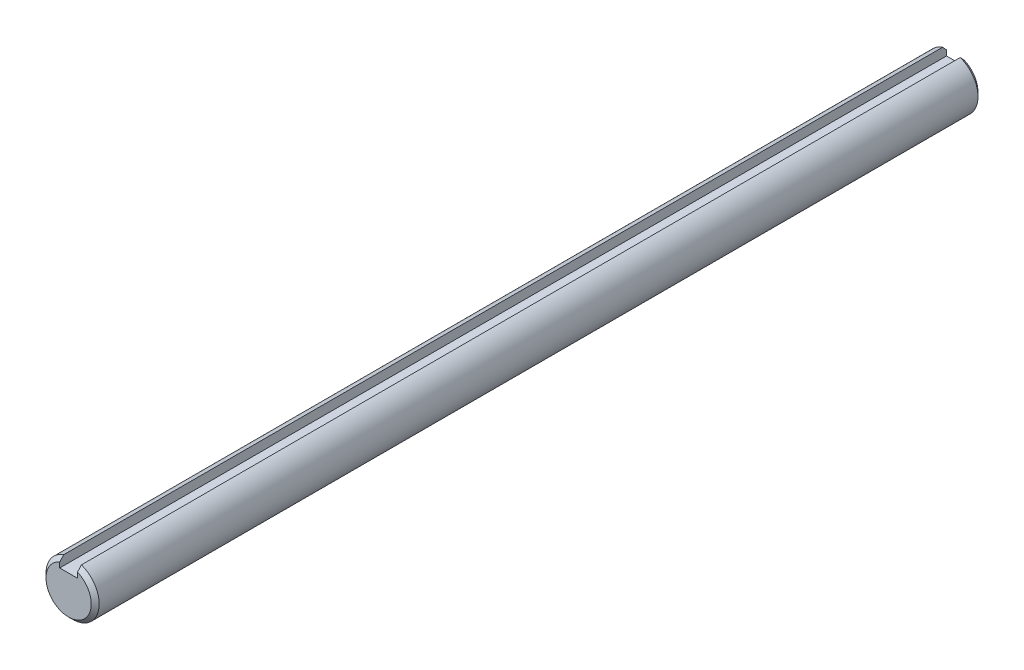
ISO-10303-21;
HEADER;
FILE_DESCRIPTION(('STEP AP214'),'2;1');
FILE_NAME('part.step','',(''),(''),'','','');
FILE_SCHEMA(('AUTOMOTIVE_DESIGN { 1 0 10303 214 1 1 1 1 }'));
ENDSEC;
DATA;
#1=APPLICATION_CONTEXT('core data for automotive mechanical design processes');
#2=APPLICATION_PROTOCOL_DEFINITION('international standard','automotive_design',2000,#1);
#3=PRODUCT_CONTEXT('',#1,'mechanical');
#4=PRODUCT('Part','Part','',(#3));
#5=PRODUCT_RELATED_PRODUCT_CATEGORY('part','',(#4));
#6=PRODUCT_DEFINITION_FORMATION('','',#4);
#7=PRODUCT_DEFINITION_CONTEXT('part definition',#1,'design');
#8=PRODUCT_DEFINITION('design','',#6,#7);
#9=PRODUCT_DEFINITION_SHAPE('','',#8);
#10=(LENGTH_UNIT() NAMED_UNIT(*) SI_UNIT(.MILLI.,.METRE.));
#11=(NAMED_UNIT(*) PLANE_ANGLE_UNIT() SI_UNIT($,.RADIAN.));
#12=(NAMED_UNIT(*) SI_UNIT($,.STERADIAN.) SOLID_ANGLE_UNIT());
#13=UNCERTAINTY_MEASURE_WITH_UNIT(LENGTH_MEASURE(1.E-05),#10,'distance_accuracy_value','');
#14=(GEOMETRIC_REPRESENTATION_CONTEXT(3) GLOBAL_UNCERTAINTY_ASSIGNED_CONTEXT((#13)) GLOBAL_UNIT_ASSIGNED_CONTEXT((#10,
#11,#12)) REPRESENTATION_CONTEXT('',''));
#15=CARTESIAN_POINT('',(0.,0.,0.));
#16=DIRECTION('',(0.,0.,1.));
#17=DIRECTION('',(1.,0.,0.));
#18=AXIS2_PLACEMENT_3D('',#15,#16,#17);
#19=CARTESIAN_POINT('',(0.,0.,100.));
#20=DIRECTION('',(0.,0.,-1.));
#21=DIRECTION('',(-1.,0.,0.));
#22=AXIS2_PLACEMENT_3D('',#19,#20,#21);
#23=CYLINDRICAL_SURFACE('',#22,6.);
#24=CARTESIAN_POINT('',(0.,0.,99.1));
#25=DIRECTION('',(0.,0.,1.));
#26=DIRECTION('',(1.,0.,0.));
#27=AXIS2_PLACEMENT_3D('',#24,#25,#26);
#28=CIRCLE('',#27,6.);
#29=CARTESIAN_POINT('',(2.,5.65685424949238,99.1));
#30=VERTEX_POINT('',#29);
#31=CARTESIAN_POINT('',(-2.,5.65685424949238,99.1));
#32=VERTEX_POINT('',#31);
#33=EDGE_CURVE('E157',#30,#32,#28,.F.);
#34=ORIENTED_EDGE('',*,*,#33,.T.);
#35=DIRECTION('',(0.,0.,-1.));
#36=VECTOR('',#35,1.);
#37=CARTESIAN_POINT('',(-2.,5.65685424949238,100.));
#38=LINE('',#37,#36);
#39=CARTESIAN_POINT('',(-2.,5.65685424949238,-99.1));
#40=VERTEX_POINT('',#39);
#41=EDGE_CURVE('E134',#32,#40,#38,.T.);
#42=ORIENTED_EDGE('',*,*,#41,.T.);
#43=CARTESIAN_POINT('',(0.,0.,-99.1));
#44=DIRECTION('',(0.,0.,1.));
#45=DIRECTION('',(1.,0.,0.));
#46=AXIS2_PLACEMENT_3D('',#43,#44,#45);
#47=CIRCLE('',#46,6.);
#48=CARTESIAN_POINT('',(2.,5.65685424949238,-99.1));
#49=VERTEX_POINT('',#48);
#50=EDGE_CURVE('E154',#40,#49,#47,.T.);
#51=ORIENTED_EDGE('',*,*,#50,.T.);
#52=DIRECTION('',(0.,0.,-1.));
#53=VECTOR('',#52,1.);
#54=CARTESIAN_POINT('',(2.,5.65685424949238,100.));
#55=LINE('',#54,#53);
#56=EDGE_CURVE('E123',#49,#30,#55,.F.);
#57=ORIENTED_EDGE('',*,*,#56,.T.);
#58=EDGE_LOOP('',(#34,#42,#51,#57));
#59=FACE_BOUND('',#58,.T.);
#60=ADVANCED_FACE('F37',(#59),#23,.T.);
#61=CARTESIAN_POINT('',(0.,0.,100.));
#62=DIRECTION('',(0.,0.,1.));
#63=DIRECTION('',(1.,0.,0.));
#64=AXIS2_PLACEMENT_3D('',#61,#62,#63);
#65=PLANE('',#64);
#66=DIRECTION('',(0.,-1.,0.));
#67=VECTOR('',#66,1.);
#68=CARTESIAN_POINT('',(-2.,6.,100.));
#69=LINE('',#68,#67);
#70=CARTESIAN_POINT('',(-2.,4.69148164229592,100.));
#71=VERTEX_POINT('',#70);
#72=CARTESIAN_POINT('',(-2.,3.5,100.));
#73=VERTEX_POINT('',#72);
#74=EDGE_CURVE('E93',#71,#73,#69,.T.);
#75=ORIENTED_EDGE('',*,*,#74,.F.);
#76=CARTESIAN_POINT('',(0.,0.,100.));
#77=DIRECTION('',(0.,0.,1.));
#78=DIRECTION('',(1.,0.,0.));
#79=AXIS2_PLACEMENT_3D('',#76,#77,#78);
#80=CIRCLE('',#79,5.09999999999997);
#81=CARTESIAN_POINT('',(2.,4.69148164229592,100.));
#82=VERTEX_POINT('',#81);
#83=EDGE_CURVE('E149',#71,#82,#80,.T.);
#84=ORIENTED_EDGE('',*,*,#83,.T.);
#85=DIRECTION('',(0.,1.,0.));
#86=VECTOR('',#85,1.);
#87=CARTESIAN_POINT('',(2.,6.,100.));
#88=LINE('',#87,#86);
#89=CARTESIAN_POINT('',(2.,3.5,100.));
#90=VERTEX_POINT('',#89);
#91=EDGE_CURVE('E58',#90,#82,#88,.T.);
#92=ORIENTED_EDGE('',*,*,#91,.F.);
#93=DIRECTION('',(1.,0.,0.));
#94=VECTOR('',#93,1.);
#95=CARTESIAN_POINT('',(-2.,3.5,100.));
#96=LINE('',#95,#94);
#97=EDGE_CURVE('E103',#73,#90,#96,.T.);
#98=ORIENTED_EDGE('',*,*,#97,.F.);
#99=EDGE_LOOP('',(#75,#84,#92,#98));
#100=FACE_BOUND('',#99,.T.);
#101=ADVANCED_FACE('F114',(#100),#65,.T.);
#102=CARTESIAN_POINT('',(0.,0.,-100.));
#103=DIRECTION('',(0.,0.,1.));
#104=DIRECTION('',(1.,0.,0.));
#105=AXIS2_PLACEMENT_3D('',#102,#103,#104);
#106=PLANE('',#105);
#107=CARTESIAN_POINT('',(0.,0.,-100.));
#108=DIRECTION('',(0.,0.,1.));
#109=DIRECTION('',(1.,0.,0.));
#110=AXIS2_PLACEMENT_3D('',#107,#108,#109);
#111=CIRCLE('',#110,5.09999999999999);
#112=CARTESIAN_POINT('',(2.,4.69148164229595,-100.));
#113=VERTEX_POINT('',#112);
#114=CARTESIAN_POINT('',(-2.,4.69148164229595,-100.));
#115=VERTEX_POINT('',#114);
#116=EDGE_CURVE('E151',#113,#115,#111,.F.);
#117=ORIENTED_EDGE('',*,*,#116,.T.);
#118=DIRECTION('',(0.,-1.,0.));
#119=VECTOR('',#118,1.);
#120=CARTESIAN_POINT('',(-2.,6.,-100.));
#121=LINE('',#120,#119);
#122=CARTESIAN_POINT('',(-2.,3.5,-100.));
#123=VERTEX_POINT('',#122);
#124=EDGE_CURVE('E116',#115,#123,#121,.T.);
#125=ORIENTED_EDGE('',*,*,#124,.T.);
#126=DIRECTION('',(1.,0.,0.));
#127=VECTOR('',#126,1.);
#128=CARTESIAN_POINT('',(-2.,3.5,-100.));
#129=LINE('',#128,#127);
#130=CARTESIAN_POINT('',(2.,3.5,-100.));
#131=VERTEX_POINT('',#130);
#132=EDGE_CURVE('E109',#123,#131,#129,.T.);
#133=ORIENTED_EDGE('',*,*,#132,.T.);
#134=DIRECTION('',(0.,1.,0.));
#135=VECTOR('',#134,1.);
#136=CARTESIAN_POINT('',(2.,6.,-100.));
#137=LINE('',#136,#135);
#138=EDGE_CURVE('E112',#131,#113,#137,.T.);
#139=ORIENTED_EDGE('',*,*,#138,.T.);
#140=EDGE_LOOP('',(#117,#125,#133,#139));
#141=FACE_BOUND('',#140,.T.);
#142=ADVANCED_FACE('F169',(#141),#106,.F.);
#143=CARTESIAN_POINT('',(0.,0.,-99.1));
#144=DIRECTION('',(0.,0.,1.));
#145=DIRECTION('',(1.,0.,0.));
#146=AXIS2_PLACEMENT_3D('',#143,#144,#145);
#147=CONICAL_SURFACE('',#146,6.,0.785398163397446);
#148=CARTESIAN_POINT('',(-2.,2.02493960368246,-102.253883277418));
#149=CARTESIAN_POINT('',(-2.,2.08628563203629,-102.210227503353));
#150=CARTESIAN_POINT('',(-2.,2.1471743684589,-102.165937910615));
#151=CARTESIAN_POINT('',(-2.,2.26814950030358,-102.076286928569));
#152=CARTESIAN_POINT('',(-2.,2.32823597131035,-102.030925641361));
#153=CARTESIAN_POINT('',(-2.,2.50743635136814,-101.893546957045));
#154=CARTESIAN_POINT('',(-2.,2.62553344657275,-101.80020431167));
#155=CARTESIAN_POINT('',(-2.,2.85959361791344,-101.611083079517));
#156=CARTESIAN_POINT('',(-2.,2.97555830187642,-101.515306469625));
#157=CARTESIAN_POINT('',(-2.,3.20593840948061,-101.321888251157));
#158=CARTESIAN_POINT('',(-2.,3.32035367451813,-101.224246454083));
#159=CARTESIAN_POINT('',(-2.,3.54785517007425,-101.027653601627));
#160=CARTESIAN_POINT('',(-2.,3.66094259306008,-100.928703922955));
#161=CARTESIAN_POINT('',(-2.,3.88614776360548,-100.729717016313));
#162=CARTESIAN_POINT('',(-2.,3.99826554616221,-100.62967982789));
#163=CARTESIAN_POINT('',(-2.,4.33351806523388,-100.32823310885));
#164=CARTESIAN_POINT('',(-2.,4.55549559196273,-100.125537577174));
#165=CARTESIAN_POINT('',(-2.,5.0978048620479,-99.6253147183185));
#166=CARTESIAN_POINT('',(-2.,5.41699197993692,-99.3265508639505));
#167=CARTESIAN_POINT('',(-2.,6.0527020924874,-98.7262732467371));
#168=CARTESIAN_POINT('',(-2.,6.36922534353331,-98.4247597544882));
#169=CARTESIAN_POINT('',(-2.,7.00088605024865,-97.8196005718118));
#170=CARTESIAN_POINT('',(-2.,7.31602162295181,-97.5159529180845));
#171=CARTESIAN_POINT('',(-2.,7.78783952483059,-97.0595474723489));
#172=CARTESIAN_POINT('',(-2.,7.94496955896897,-96.9072518111814));
#173=CARTESIAN_POINT('',(-2.,8.2589741206815,-96.602397959623));
#174=CARTESIAN_POINT('',(-2.,8.41584864880143,-96.4498397697944));
#175=CARTESIAN_POINT('',(-2.,8.57261726684608,-96.2971727948444));
#176=B_SPLINE_CURVE_WITH_KNOTS('',3,(#148,#149,#150,#151,#152,#153,#154,#155,#156,#157,#158,
#159,#160,#161,#162,#163,#164,#165,#166,#167,#168,#169,#170,#171,#172,#173,#174,#175),
.UNSPECIFIED.,.F.,.F.,(4,2,2,2,2,2,2,2,2,2,2,2,2,4),(0.,0.225869795218503,0.451718157993796,
0.903258836147416,1.35444380419749,1.80567461315825,2.25646325766357,2.7072355634087,
3.60900454222464,4.9205635457937,6.23199484035928,7.54485331250394,8.20132424883203,
8.85779378103657),.UNSPECIFIED.);
#177=EDGE_CURVE('E66',#115,#40,#176,.T.);
#178=ORIENTED_EDGE('',*,*,#177,.F.);
#179=ORIENTED_EDGE('',*,*,#116,.F.);
#180=CARTESIAN_POINT('',(2.,8.57261726684608,-96.2971727948444));
#181=CARTESIAN_POINT('',(2.,8.41584864880143,-96.4498397697944));
#182=CARTESIAN_POINT('',(2.,8.2589741206815,-96.602397959623));
#183=CARTESIAN_POINT('',(2.,7.94496955896897,-96.9072518111814));
#184=CARTESIAN_POINT('',(2.,7.78783952483059,-97.0595474723489));
#185=CARTESIAN_POINT('',(2.,7.3160216229518,-97.5159529180845));
#186=CARTESIAN_POINT('',(2.,7.00088605024864,-97.8196005718118));
#187=CARTESIAN_POINT('',(2.,6.3692253435333,-98.4247597544882));
#188=CARTESIAN_POINT('',(2.,6.05270209248739,-98.7262732467371));
#189=CARTESIAN_POINT('',(2.,5.41699197993691,-99.3265508639505));
#190=CARTESIAN_POINT('',(2.,5.09780486204789,-99.6253147183185));
#191=CARTESIAN_POINT('',(2.,4.55549559196272,-100.125537577174));
#192=CARTESIAN_POINT('',(2.,4.33351806523387,-100.32823310885));
#193=CARTESIAN_POINT('',(2.,3.99826554616219,-100.62967982789));
#194=CARTESIAN_POINT('',(2.,3.88614776360546,-100.729717016313));
#195=CARTESIAN_POINT('',(2.,3.66094259306007,-100.928703922955));
#196=CARTESIAN_POINT('',(2.,3.54785517007424,-101.027653601627));
#197=CARTESIAN_POINT('',(2.,3.32035367451811,-101.224246454083));
#198=CARTESIAN_POINT('',(2.,3.2059384094806,-101.321888251157));
#199=CARTESIAN_POINT('',(2.,2.9755583018764,-101.515306469625));
#200=CARTESIAN_POINT('',(2.,2.85959361791342,-101.611083079517));
#201=CARTESIAN_POINT('',(2.,2.62553344657274,-101.80020431167));
#202=CARTESIAN_POINT('',(2.,2.50743635136813,-101.893546957045));
#203=CARTESIAN_POINT('',(2.,2.32823597131035,-102.030925641361));
#204=CARTESIAN_POINT('',(2.,2.26814950030358,-102.076286928569));
#205=CARTESIAN_POINT('',(2.,2.1471743684589,-102.165937910615));
#206=CARTESIAN_POINT('',(2.,2.08628563203629,-102.210227503353));
#207=CARTESIAN_POINT('',(2.,2.02493960368246,-102.253883277418));
#208=B_SPLINE_CURVE_WITH_KNOTS('',3,(#180,#181,#182,#183,#184,#185,#186,#187,#188,#189,#190,
#191,#192,#193,#194,#195,#196,#197,#198,#199,#200,#201,#202,#203,#204,#205,#206,#207),
.UNSPECIFIED.,.F.,.F.,(4,2,2,2,2,2,2,2,2,2,2,2,2,4),(0.,0.656469532204536,1.31294046853263,
2.62579894067731,3.93723023524287,5.24878923881193,6.1505582176279,6.60133052337301,
7.05211916787833,7.5033499768391,7.95453494488916,8.40607562304278,8.63192398581806,
8.85779378103656),.UNSPECIFIED.);
#209=EDGE_CURVE('E127',#49,#113,#208,.T.);
#210=ORIENTED_EDGE('',*,*,#209,.F.);
#211=ORIENTED_EDGE('',*,*,#50,.F.);
#212=EDGE_LOOP('',(#178,#179,#210,#211));
#213=FACE_BOUND('',#212,.T.);
#214=ADVANCED_FACE('F136',(#213),#147,.T.);
#215=CARTESIAN_POINT('',(0.,0.,100.));
#216=DIRECTION('',(0.,0.,-1.));
#217=DIRECTION('',(-1.,0.,0.));
#218=AXIS2_PLACEMENT_3D('',#215,#216,#217);
#219=CONICAL_SURFACE('',#218,5.09999999999997,0.785398163397461);
#220=CARTESIAN_POINT('',(-2.,8.57261726684611,96.2971727948444));
#221=CARTESIAN_POINT('',(-2.,8.41584864880146,96.4498397697945));
#222=CARTESIAN_POINT('',(-2.,8.25897412068153,96.6023979596231));
#223=CARTESIAN_POINT('',(-2.,7.94496955896899,96.9072518111814));
#224=CARTESIAN_POINT('',(-2.,7.78783952483061,97.0595474723489));
#225=CARTESIAN_POINT('',(-2.,7.31602162295182,97.5159529180845));
#226=CARTESIAN_POINT('',(-2.,7.00088605024866,97.8196005718118));
#227=CARTESIAN_POINT('',(-2.,6.36922534353331,98.4247597544882));
#228=CARTESIAN_POINT('',(-2.,6.05270209248739,98.7262732467371));
#229=CARTESIAN_POINT('',(-2.,5.41699197993691,99.3265508639505));
#230=CARTESIAN_POINT('',(-2.,5.09780486204789,99.6253147183185));
#231=CARTESIAN_POINT('',(-2.,4.55549559196272,100.125537577174));
#232=CARTESIAN_POINT('',(-2.,4.33351806523389,100.32823310885));
#233=CARTESIAN_POINT('',(-2.,3.99826554616222,100.62967982789));
#234=CARTESIAN_POINT('',(-2.,3.8861477636055,100.729717016313));
#235=CARTESIAN_POINT('',(-2.,3.66094259306011,100.928703922955));
#236=CARTESIAN_POINT('',(-2.,3.54785517007429,101.027653601627));
#237=CARTESIAN_POINT('',(-2.,3.32035367451817,101.224246454083));
#238=CARTESIAN_POINT('',(-2.,3.20593840948066,101.321888251157));
#239=CARTESIAN_POINT('',(-2.,2.97555830187648,101.515306469625));
#240=CARTESIAN_POINT('',(-2.,2.85959361791351,101.611083079517));
#241=CARTESIAN_POINT('',(-2.,2.62553344657284,101.80020431167));
#242=CARTESIAN_POINT('',(-2.,2.50743635136823,101.893546957045));
#243=CARTESIAN_POINT('',(-2.,2.32823597131046,102.030925641361));
#244=CARTESIAN_POINT('',(-2.,2.26814950030369,102.076286928569));
#245=CARTESIAN_POINT('',(-2.,2.14717436845901,102.165937910615));
#246=CARTESIAN_POINT('',(-2.,2.08628563203641,102.210227503352));
#247=CARTESIAN_POINT('',(-2.,2.02493960368258,102.253883277418));
#248=B_SPLINE_CURVE_WITH_KNOTS('',3,(#220,#221,#222,#223,#224,#225,#226,#227,#228,#229,#230,
#231,#232,#233,#234,#235,#236,#237,#238,#239,#240,#241,#242,#243,#244,#245,#246,#247),
.UNSPECIFIED.,.F.,.F.,(4,2,2,2,2,2,2,2,2,2,2,2,2,4),(0.,0.656469532204544,1.31294046853262,
2.62579894067729,3.93723023524285,5.24878923881191,6.15055821762781,6.60133052337292,
7.05211916787821,7.50334997683895,7.95453494488899,8.40607562304257,8.63192398581786,
8.85779378103635),.UNSPECIFIED.);
#249=EDGE_CURVE('E11',#32,#71,#248,.T.);
#250=ORIENTED_EDGE('',*,*,#249,.F.);
#251=ORIENTED_EDGE('',*,*,#33,.F.);
#252=CARTESIAN_POINT('',(2.,2.02493960368258,102.253883277418));
#253=CARTESIAN_POINT('',(2.,2.0862856320364,102.210227503352));
#254=CARTESIAN_POINT('',(2.,2.14717436845901,102.165937910615));
#255=CARTESIAN_POINT('',(2.,2.26814950030368,102.076286928569));
#256=CARTESIAN_POINT('',(2.,2.32823597131045,102.030925641361));
#257=CARTESIAN_POINT('',(2.,2.50743635136822,101.893546957045));
#258=CARTESIAN_POINT('',(2.,2.62553344657283,101.80020431167));
#259=CARTESIAN_POINT('',(2.,2.8595936179135,101.611083079517));
#260=CARTESIAN_POINT('',(2.,2.97555830187647,101.515306469625));
#261=CARTESIAN_POINT('',(2.,3.20593840948066,101.321888251157));
#262=CARTESIAN_POINT('',(2.,3.32035367451816,101.224246454083));
#263=CARTESIAN_POINT('',(2.,3.54785517007427,101.027653601627));
#264=CARTESIAN_POINT('',(2.,3.66094259306009,100.928703922955));
#265=CARTESIAN_POINT('',(2.,3.88614776360547,100.729717016313));
#266=CARTESIAN_POINT('',(2.,3.9982655461622,100.62967982789));
#267=CARTESIAN_POINT('',(2.,4.33351806523387,100.32823310885));
#268=CARTESIAN_POINT('',(2.,4.55549559196271,100.125537577174));
#269=CARTESIAN_POINT('',(2.,5.09780486204788,99.6253147183185));
#270=CARTESIAN_POINT('',(2.,5.4169919799369,99.3265508639505));
#271=CARTESIAN_POINT('',(2.,6.05270209248739,98.7262732467371));
#272=CARTESIAN_POINT('',(2.,6.36922534353331,98.4247597544882));
#273=CARTESIAN_POINT('',(2.,7.00088605024866,97.8196005718118));
#274=CARTESIAN_POINT('',(2.,7.31602162295183,97.5159529180845));
#275=CARTESIAN_POINT('',(2.,7.78783952483062,97.0595474723489));
#276=CARTESIAN_POINT('',(2.,7.944969558969,96.9072518111814));
#277=CARTESIAN_POINT('',(2.,8.25897412068153,96.6023979596231));
#278=CARTESIAN_POINT('',(2.,8.41584864880146,96.4498397697945));
#279=CARTESIAN_POINT('',(2.,8.57261726684611,96.2971727948444));
#280=B_SPLINE_CURVE_WITH_KNOTS('',3,(#252,#253,#254,#255,#256,#257,#258,#259,#260,#261,#262,
#263,#264,#265,#266,#267,#268,#269,#270,#271,#272,#273,#274,#275,#276,#277,#278,#279),
.UNSPECIFIED.,.F.,.F.,(4,2,2,2,2,2,2,2,2,2,2,2,2,4),(0.,0.225869795218485,0.451718157993761,
0.903258836147357,1.35444380419739,1.80567461315812,2.2564632576634,2.7072355634085,
3.60900454222442,4.92056354579348,6.23199484035907,7.54485331250374,8.20132424883182,
8.85779378103635),.UNSPECIFIED.);
#281=EDGE_CURVE('E51',#82,#30,#280,.T.);
#282=ORIENTED_EDGE('',*,*,#281,.F.);
#283=ORIENTED_EDGE('',*,*,#83,.F.);
#284=EDGE_LOOP('',(#250,#251,#282,#283));
#285=FACE_BOUND('',#284,.T.);
#286=ADVANCED_FACE('F39',(#285),#219,.T.);
#287=CARTESIAN_POINT('',(-2.,6.,-100.));
#288=DIRECTION('',(-1.,0.,0.));
#289=DIRECTION('',(0.,-1.,0.));
#290=AXIS2_PLACEMENT_3D('',#287,#288,#289);
#291=PLANE('',#290);
#292=ORIENTED_EDGE('',*,*,#177,.T.);
#293=ORIENTED_EDGE('',*,*,#41,.F.);
#294=ORIENTED_EDGE('',*,*,#249,.T.);
#295=ORIENTED_EDGE('',*,*,#74,.T.);
#296=DIRECTION('',(0.,0.,1.));
#297=VECTOR('',#296,1.);
#298=CARTESIAN_POINT('',(-2.,3.5,-100.));
#299=LINE('',#298,#297);
#300=EDGE_CURVE('E96',#123,#73,#299,.T.);
#301=ORIENTED_EDGE('',*,*,#300,.F.);
#302=ORIENTED_EDGE('',*,*,#124,.F.);
#303=EDGE_LOOP('',(#292,#293,#294,#295,#301,#302));
#304=FACE_BOUND('',#303,.T.);
#305=ADVANCED_FACE('F95',(#304),#291,.F.);
#306=CARTESIAN_POINT('',(2.,6.,-100.));
#307=DIRECTION('',(1.,0.,0.));
#308=DIRECTION('',(0.,1.,0.));
#309=AXIS2_PLACEMENT_3D('',#306,#307,#308);
#310=PLANE('',#309);
#311=ORIENTED_EDGE('',*,*,#209,.T.);
#312=ORIENTED_EDGE('',*,*,#138,.F.);
#313=DIRECTION('',(0.,0.,1.));
#314=VECTOR('',#313,1.);
#315=CARTESIAN_POINT('',(2.,3.5,-100.));
#316=LINE('',#315,#314);
#317=EDGE_CURVE('E111',#131,#90,#316,.T.);
#318=ORIENTED_EDGE('',*,*,#317,.T.);
#319=ORIENTED_EDGE('',*,*,#91,.T.);
#320=ORIENTED_EDGE('',*,*,#281,.T.);
#321=ORIENTED_EDGE('',*,*,#56,.F.);
#322=EDGE_LOOP('',(#311,#312,#318,#319,#320,#321));
#323=FACE_BOUND('',#322,.T.);
#324=ADVANCED_FACE('F139',(#323),#310,.F.);
#325=CARTESIAN_POINT('',(-2.,3.5,-100.));
#326=DIRECTION('',(0.,-1.,0.));
#327=DIRECTION('',(0.,0.,-1.));
#328=AXIS2_PLACEMENT_3D('',#325,#326,#327);
#329=PLANE('',#328);
#330=ORIENTED_EDGE('',*,*,#317,.F.);
#331=ORIENTED_EDGE('',*,*,#132,.F.);
#332=ORIENTED_EDGE('',*,*,#300,.T.);
#333=ORIENTED_EDGE('',*,*,#97,.T.);
#334=EDGE_LOOP('',(#330,#331,#332,#333));
#335=FACE_BOUND('',#334,.T.);
#336=ADVANCED_FACE('F107',(#335),#329,.F.);
#337=CLOSED_SHELL('',(#60,#101,#142,#214,#286,#305,#324,#336));
#338=MANIFOLD_SOLID_BREP('B2',#337);
#339=ADVANCED_BREP_SHAPE_REPRESENTATION('',(#18,#338),#14);
#340=SHAPE_DEFINITION_REPRESENTATION(#9,#339);
ENDSEC;
END-ISO-10303-21;
